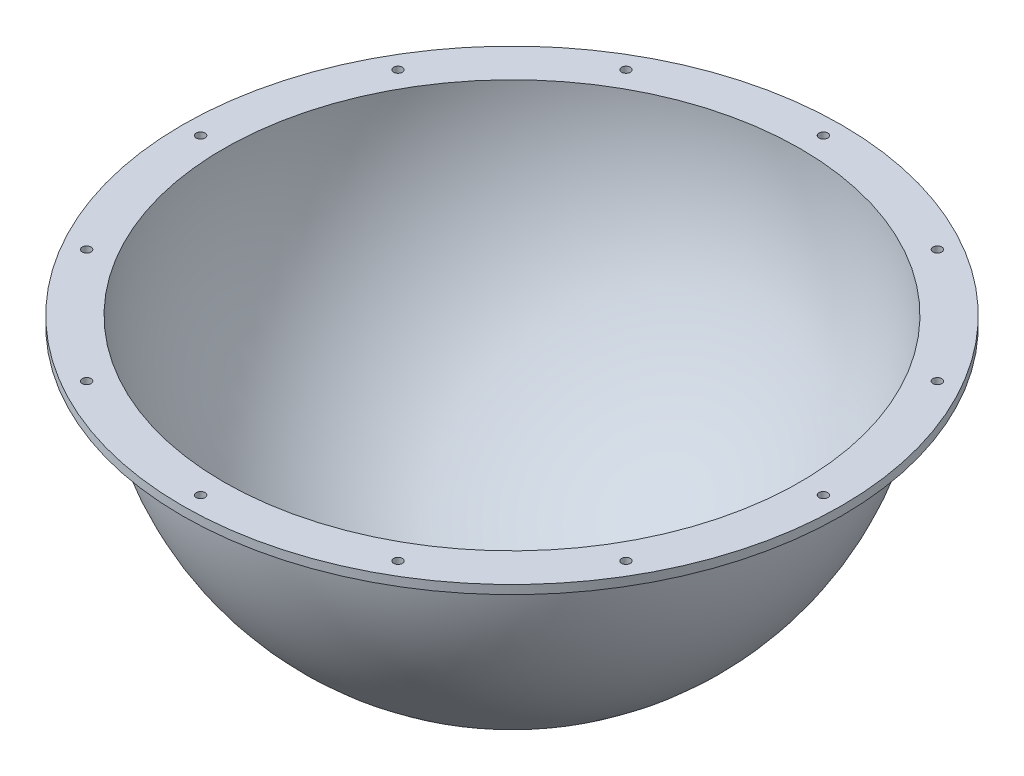
ISO-10303-21;
HEADER;
FILE_DESCRIPTION(('STEP AP214'),'2;1');
FILE_NAME('part.step','',(''),(''),'','','');
FILE_SCHEMA(('AUTOMOTIVE_DESIGN { 1 0 10303 214 1 1 1 1 }'));
ENDSEC;
DATA;
#1=APPLICATION_CONTEXT('core data for automotive mechanical design processes');
#2=APPLICATION_PROTOCOL_DEFINITION('international standard','automotive_design',2000,#1);
#3=PRODUCT_CONTEXT('',#1,'mechanical');
#4=PRODUCT('Part','Part','',(#3));
#5=PRODUCT_RELATED_PRODUCT_CATEGORY('part','',(#4));
#6=PRODUCT_DEFINITION_FORMATION('','',#4);
#7=PRODUCT_DEFINITION_CONTEXT('part definition',#1,'design');
#8=PRODUCT_DEFINITION('design','',#6,#7);
#9=PRODUCT_DEFINITION_SHAPE('','',#8);
#10=(LENGTH_UNIT() NAMED_UNIT(*) SI_UNIT(.MILLI.,.METRE.));
#11=(NAMED_UNIT(*) PLANE_ANGLE_UNIT() SI_UNIT($,.RADIAN.));
#12=(NAMED_UNIT(*) SI_UNIT($,.STERADIAN.) SOLID_ANGLE_UNIT());
#13=UNCERTAINTY_MEASURE_WITH_UNIT(LENGTH_MEASURE(1.E-05),#10,'distance_accuracy_value','');
#14=(GEOMETRIC_REPRESENTATION_CONTEXT(3) GLOBAL_UNCERTAINTY_ASSIGNED_CONTEXT((#13)) GLOBAL_UNIT_ASSIGNED_CONTEXT((#10,
#11,#12)) REPRESENTATION_CONTEXT('',''));
#15=CARTESIAN_POINT('',(0.,0.,0.));
#16=DIRECTION('',(0.,0.,1.));
#17=DIRECTION('',(1.,0.,0.));
#18=AXIS2_PLACEMENT_3D('',#15,#16,#17);
#19=CARTESIAN_POINT('',(0.,0.,0.));
#20=DIRECTION('',(0.,0.,-1.));
#21=DIRECTION('',(-1.,0.,0.));
#22=AXIS2_PLACEMENT_3D('',#19,#20,#21);
#23=SPHERICAL_SURFACE('',#22,393.75);
#24=CARTESIAN_POINT('',(0.,0.,0.));
#25=DIRECTION('',(0.,1.,0.));
#26=DIRECTION('',(0.,0.,1.));
#27=AXIS2_PLACEMENT_3D('',#24,#25,#26);
#28=SPHERICAL_SURFACE('',#27,393.75);
#29=CARTESIAN_POINT('',(0.,0.,0.));
#30=DIRECTION('',(0.,1.,0.));
#31=DIRECTION('',(0.,0.,1.));
#32=AXIS2_PLACEMENT_3D('',#29,#30,#31);
#33=CIRCLE('',#32,393.75);
#34=CARTESIAN_POINT('',(0.,0.,393.75));
#35=VERTEX_POINT('',#34);
#36=EDGE_CURVE('E10',#35,#35,#33,.T.);
#37=ORIENTED_EDGE('',*,*,#36,.T.);
#38=EDGE_LOOP('',(#37));
#39=FACE_BOUND('',#38,.T.);
#40=ADVANCED_FACE('F31',(#39),#28,.F.);
#41=CARTESIAN_POINT('',(0.,0.,0.));
#42=DIRECTION('',(0.,-1.,0.));
#43=DIRECTION('',(0.,0.,1.));
#44=AXIS2_PLACEMENT_3D('',#41,#42,#43);
#45=PLANE('',#44);
#46=CARTESIAN_POINT('',(0.,0.,-425.));
#47=DIRECTION('',(0.,1.,0.));
#48=DIRECTION('',(-1.,0.,0.));
#49=AXIS2_PLACEMENT_3D('',#46,#47,#48);
#50=CIRCLE('',#49,6.);
#51=CARTESIAN_POINT('',(-6.,0.,-425.));
#52=VERTEX_POINT('',#51);
#53=EDGE_CURVE('E52',#52,#52,#50,.T.);
#54=ORIENTED_EDGE('',*,*,#53,.F.);
#55=EDGE_LOOP('',(#54));
#56=FACE_BOUND('',#55,.T.);
#57=CARTESIAN_POINT('',(212.500000000001,1.48387956900834E-12,-368.060796608386));
#58=DIRECTION('',(0.,1.,0.));
#59=DIRECTION('',(-1.,0.,0.));
#60=AXIS2_PLACEMENT_3D('',#57,#58,#59);
#61=CIRCLE('',#60,6.00000000000002);
#62=CARTESIAN_POINT('',(206.500000000001,1.44198179294222E-12,-368.060796608386));
#63=VERTEX_POINT('',#62);
#64=EDGE_CURVE('E117',#63,#63,#61,.T.);
#65=ORIENTED_EDGE('',*,*,#64,.F.);
#66=EDGE_LOOP('',(#65));
#67=FACE_BOUND('',#66,.T.);
#68=CARTESIAN_POINT('',(368.060796608387,2.57015480583584E-12,-212.5));
#69=DIRECTION('',(0.,1.,0.));
#70=DIRECTION('',(-1.,0.,0.));
#71=AXIS2_PLACEMENT_3D('',#68,#69,#70);
#72=CIRCLE('',#71,5.99999999999999);
#73=CARTESIAN_POINT('',(362.060796608387,2.52825702976973E-12,-212.5));
#74=VERTEX_POINT('',#73);
#75=EDGE_CURVE('E120',#74,#74,#72,.T.);
#76=ORIENTED_EDGE('',*,*,#75,.F.);
#77=EDGE_LOOP('',(#76));
#78=FACE_BOUND('',#77,.T.);
#79=CARTESIAN_POINT('',(425.000000000001,2.96775913801667E-12,5.6230663368303E-13));
#80=DIRECTION('',(0.,1.,0.));
#81=DIRECTION('',(-1.,0.,0.));
#82=AXIS2_PLACEMENT_3D('',#79,#80,#81);
#83=CIRCLE('',#82,5.99999999999999);
#84=CARTESIAN_POINT('',(419.000000000001,2.92586136195055E-12,5.6230663368303E-13));
#85=VERTEX_POINT('',#84);
#86=EDGE_CURVE('E109',#85,#85,#83,.T.);
#87=ORIENTED_EDGE('',*,*,#86,.F.);
#88=EDGE_LOOP('',(#87));
#89=FACE_BOUND('',#88,.T.);
#90=CARTESIAN_POINT('',(-212.5,-1.48387956900833E-12,-368.060796608386));
#91=DIRECTION('',(0.,1.,0.));
#92=DIRECTION('',(-1.,0.,0.));
#93=AXIS2_PLACEMENT_3D('',#90,#91,#92);
#94=CIRCLE('',#93,5.99999999999999);
#95=CARTESIAN_POINT('',(-218.5,-1.52577734507445E-12,-368.060796608386));
#96=VERTEX_POINT('',#95);
#97=EDGE_CURVE('E102',#96,#96,#94,.T.);
#98=ORIENTED_EDGE('',*,*,#97,.F.);
#99=EDGE_LOOP('',(#98));
#100=FACE_BOUND('',#99,.T.);
#101=CARTESIAN_POINT('',(-368.060796608387,-2.57015480583584E-12,-212.499999999999));
#102=DIRECTION('',(0.,1.,0.));
#103=DIRECTION('',(-1.,0.,0.));
#104=AXIS2_PLACEMENT_3D('',#101,#102,#103);
#105=CIRCLE('',#104,5.99999999999999);
#106=CARTESIAN_POINT('',(-374.060796608387,-2.61205258190196E-12,-212.499999999999));
#107=VERTEX_POINT('',#106);
#108=EDGE_CURVE('E99',#107,#107,#105,.T.);
#109=ORIENTED_EDGE('',*,*,#108,.F.);
#110=EDGE_LOOP('',(#109));
#111=FACE_BOUND('',#110,.T.);
#112=CARTESIAN_POINT('',(-425.000000000001,-2.96775913801667E-12,9.30143396522419E-13));
#113=DIRECTION('',(0.,1.,0.));
#114=DIRECTION('',(-1.,0.,0.));
#115=AXIS2_PLACEMENT_3D('',#112,#113,#114);
#116=CIRCLE('',#115,5.99999999999999);
#117=CARTESIAN_POINT('',(-431.000000000001,-3.00965691408278E-12,9.30143396522419E-13));
#118=VERTEX_POINT('',#117);
#119=EDGE_CURVE('E95',#118,#118,#116,.T.);
#120=ORIENTED_EDGE('',*,*,#119,.F.);
#121=EDGE_LOOP('',(#120));
#122=FACE_BOUND('',#121,.T.);
#123=CARTESIAN_POINT('',(-368.060796608387,-2.57015480583584E-12,212.500000000001));
#124=DIRECTION('',(0.,1.,0.));
#125=DIRECTION('',(-1.,0.,0.));
#126=AXIS2_PLACEMENT_3D('',#123,#124,#125);
#127=CIRCLE('',#126,5.99999999999999);
#128=CARTESIAN_POINT('',(-374.060796608387,-2.61205258190196E-12,212.500000000001));
#129=VERTEX_POINT('',#128);
#130=EDGE_CURVE('E92',#129,#129,#127,.T.);
#131=ORIENTED_EDGE('',*,*,#130,.F.);
#132=EDGE_LOOP('',(#131));
#133=FACE_BOUND('',#132,.T.);
#134=CARTESIAN_POINT('',(-212.5,-1.48387956900833E-12,368.060796608388));
#135=DIRECTION('',(0.,1.,0.));
#136=DIRECTION('',(-1.,0.,0.));
#137=AXIS2_PLACEMENT_3D('',#134,#135,#136);
#138=CIRCLE('',#137,6.00000000000007);
#139=CARTESIAN_POINT('',(-218.5,-1.52577734507445E-12,368.060796608388));
#140=VERTEX_POINT('',#139);
#141=EDGE_CURVE('E96',#140,#140,#138,.T.);
#142=ORIENTED_EDGE('',*,*,#141,.F.);
#143=EDGE_LOOP('',(#142));
#144=FACE_BOUND('',#143,.T.);
#145=CARTESIAN_POINT('',(4.19884290470205E-13,0.,425.000000000001));
#146=DIRECTION('',(0.,1.,0.));
#147=DIRECTION('',(-1.,0.,0.));
#148=AXIS2_PLACEMENT_3D('',#145,#146,#147);
#149=CIRCLE('',#148,6.);
#150=CARTESIAN_POINT('',(-5.99999999999958,0.,425.000000000001));
#151=VERTEX_POINT('',#150);
#152=EDGE_CURVE('E112',#151,#151,#149,.T.);
#153=ORIENTED_EDGE('',*,*,#152,.F.);
#154=EDGE_LOOP('',(#153));
#155=FACE_BOUND('',#154,.T.);
#156=CARTESIAN_POINT('',(212.500000000001,1.48387956900834E-12,368.060796608388));
#157=DIRECTION('',(0.,1.,0.));
#158=DIRECTION('',(-1.,0.,0.));
#159=AXIS2_PLACEMENT_3D('',#156,#157,#158);
#160=CIRCLE('',#159,5.99999999999999);
#161=CARTESIAN_POINT('',(206.500000000001,1.44198179294222E-12,368.060796608388));
#162=VERTEX_POINT('',#161);
#163=EDGE_CURVE('E108',#162,#162,#160,.T.);
#164=ORIENTED_EDGE('',*,*,#163,.F.);
#165=EDGE_LOOP('',(#164));
#166=FACE_BOUND('',#165,.T.);
#167=CARTESIAN_POINT('',(368.060796608387,2.57015480583585E-12,212.500000000001));
#168=DIRECTION('',(0.,1.,0.));
#169=DIRECTION('',(-1.,0.,0.));
#170=AXIS2_PLACEMENT_3D('',#167,#168,#169);
#171=CIRCLE('',#170,5.99999999999999);
#172=CARTESIAN_POINT('',(362.060796608387,2.52825702976973E-12,212.500000000001));
#173=VERTEX_POINT('',#172);
#174=EDGE_CURVE('E105',#173,#173,#171,.T.);
#175=ORIENTED_EDGE('',*,*,#174,.F.);
#176=EDGE_LOOP('',(#175));
#177=FACE_BOUND('',#176,.T.);
#178=ORIENTED_EDGE('',*,*,#36,.F.);
#179=EDGE_LOOP('',(#178));
#180=FACE_BOUND('',#179,.T.);
#181=CARTESIAN_POINT('',(0.,0.,0.));
#182=DIRECTION('',(0.,-1.,0.));
#183=DIRECTION('',(0.,0.,-1.));
#184=AXIS2_PLACEMENT_3D('',#181,#182,#183);
#185=CIRCLE('',#184,450.);
#186=CARTESIAN_POINT('',(0.,0.,-450.));
#187=VERTEX_POINT('',#186);
#188=EDGE_CURVE('E39',#187,#187,#185,.T.);
#189=ORIENTED_EDGE('',*,*,#188,.F.);
#190=EDGE_LOOP('',(#189));
#191=FACE_BOUND('',#190,.T.);
#192=ADVANCED_FACE('F131',(#56,#67,#78,#89,#100,#111,#122,#133,#144,#155,#166,#177,#180,#191),
#45,.F.);
#193=CARTESIAN_POINT('',(0.,0.,0.));
#194=DIRECTION('',(0.,-1.,0.));
#195=DIRECTION('',(0.,0.,-1.));
#196=AXIS2_PLACEMENT_3D('',#193,#194,#195);
#197=CYLINDRICAL_SURFACE('',#196,450.);
#198=CARTESIAN_POINT('',(0.,-12.,0.));
#199=DIRECTION('',(0.,-1.,0.));
#200=DIRECTION('',(0.,0.,-1.));
#201=AXIS2_PLACEMENT_3D('',#198,#199,#200);
#202=CIRCLE('',#201,450.);
#203=CARTESIAN_POINT('',(0.,-12.,-450.));
#204=VERTEX_POINT('',#203);
#205=EDGE_CURVE('E44',#204,#204,#202,.T.);
#206=ORIENTED_EDGE('',*,*,#205,.F.);
#207=EDGE_LOOP('',(#206));
#208=FACE_BOUND('',#207,.T.);
#209=ORIENTED_EDGE('',*,*,#188,.T.);
#210=EDGE_LOOP('',(#209));
#211=FACE_BOUND('',#210,.T.);
#212=ADVANCED_FACE('F134',(#208,#211),#197,.T.);
#213=CARTESIAN_POINT('',(0.,-12.,450.));
#214=DIRECTION('',(0.,1.,0.));
#215=DIRECTION('',(0.,0.,1.));
#216=AXIS2_PLACEMENT_3D('',#213,#214,#215);
#217=PLANE('',#216);
#218=CARTESIAN_POINT('',(0.,-12.,-425.));
#219=DIRECTION('',(0.,1.,0.));
#220=DIRECTION('',(0.,0.,1.));
#221=AXIS2_PLACEMENT_3D('',#218,#219,#220);
#222=CIRCLE('',#221,6.);
#223=CARTESIAN_POINT('',(0.,-12.,-419.));
#224=VERTEX_POINT('',#223);
#225=EDGE_CURVE('E35',#224,#224,#222,.T.);
#226=ORIENTED_EDGE('',*,*,#225,.T.);
#227=EDGE_LOOP('',(#226));
#228=FACE_BOUND('',#227,.T.);
#229=CARTESIAN_POINT('',(212.500000000001,-12.,-368.060796608386));
#230=DIRECTION('',(0.,1.,0.));
#231=DIRECTION('',(0.,0.,1.));
#232=AXIS2_PLACEMENT_3D('',#229,#230,#231);
#233=CIRCLE('',#232,6.00000000000002);
#234=CARTESIAN_POINT('',(212.500000000001,-12.,-362.060796608386));
#235=VERTEX_POINT('',#234);
#236=EDGE_CURVE('E78',#235,#235,#233,.T.);
#237=ORIENTED_EDGE('',*,*,#236,.T.);
#238=EDGE_LOOP('',(#237));
#239=FACE_BOUND('',#238,.T.);
#240=CARTESIAN_POINT('',(368.060796608387,-12.,-212.5));
#241=DIRECTION('',(0.,1.,0.));
#242=DIRECTION('',(0.,0.,1.));
#243=AXIS2_PLACEMENT_3D('',#240,#241,#242);
#244=CIRCLE('',#243,5.99999999999999);
#245=CARTESIAN_POINT('',(368.060796608387,-12.,-206.5));
#246=VERTEX_POINT('',#245);
#247=EDGE_CURVE('E76',#246,#246,#244,.T.);
#248=ORIENTED_EDGE('',*,*,#247,.T.);
#249=EDGE_LOOP('',(#248));
#250=FACE_BOUND('',#249,.T.);
#251=CARTESIAN_POINT('',(425.000000000001,-12.,5.6230663368303E-13));
#252=DIRECTION('',(0.,1.,0.));
#253=DIRECTION('',(0.,0.,1.));
#254=AXIS2_PLACEMENT_3D('',#251,#252,#253);
#255=CIRCLE('',#254,5.99999999999999);
#256=CARTESIAN_POINT('',(425.000000000001,-12.,6.00000000000055));
#257=VERTEX_POINT('',#256);
#258=EDGE_CURVE('E73',#257,#257,#255,.T.);
#259=ORIENTED_EDGE('',*,*,#258,.T.);
#260=EDGE_LOOP('',(#259));
#261=FACE_BOUND('',#260,.T.);
#262=CARTESIAN_POINT('',(-212.5,-12.,-368.060796608386));
#263=DIRECTION('',(0.,1.,0.));
#264=DIRECTION('',(0.,0.,1.));
#265=AXIS2_PLACEMENT_3D('',#262,#263,#264);
#266=CIRCLE('',#265,5.99999999999999);
#267=CARTESIAN_POINT('',(-212.5,-12.,-362.060796608386));
#268=VERTEX_POINT('',#267);
#269=EDGE_CURVE('E70',#268,#268,#266,.T.);
#270=ORIENTED_EDGE('',*,*,#269,.T.);
#271=EDGE_LOOP('',(#270));
#272=FACE_BOUND('',#271,.T.);
#273=CARTESIAN_POINT('',(-368.060796608387,-12.,-212.499999999999));
#274=DIRECTION('',(0.,1.,0.));
#275=DIRECTION('',(0.,0.,1.));
#276=AXIS2_PLACEMENT_3D('',#273,#274,#275);
#277=CIRCLE('',#276,5.99999999999999);
#278=CARTESIAN_POINT('',(-368.060796608387,-12.,-206.5));
#279=VERTEX_POINT('',#278);
#280=EDGE_CURVE('E67',#279,#279,#277,.T.);
#281=ORIENTED_EDGE('',*,*,#280,.T.);
#282=EDGE_LOOP('',(#281));
#283=FACE_BOUND('',#282,.T.);
#284=CARTESIAN_POINT('',(-425.,-12.,9.30143396522419E-13));
#285=DIRECTION('',(0.,1.,0.));
#286=DIRECTION('',(0.,0.,1.));
#287=AXIS2_PLACEMENT_3D('',#284,#285,#286);
#288=CIRCLE('',#287,5.99999999999999);
#289=CARTESIAN_POINT('',(-425.,-12.,6.00000000000092));
#290=VERTEX_POINT('',#289);
#291=EDGE_CURVE('E64',#290,#290,#288,.T.);
#292=ORIENTED_EDGE('',*,*,#291,.T.);
#293=EDGE_LOOP('',(#292));
#294=FACE_BOUND('',#293,.T.);
#295=CARTESIAN_POINT('',(-368.060796608387,-12.,212.500000000001));
#296=DIRECTION('',(0.,1.,0.));
#297=DIRECTION('',(0.,0.,1.));
#298=AXIS2_PLACEMENT_3D('',#295,#296,#297);
#299=CIRCLE('',#298,5.99999999999999);
#300=CARTESIAN_POINT('',(-368.060796608387,-12.,218.500000000001));
#301=VERTEX_POINT('',#300);
#302=EDGE_CURVE('E61',#301,#301,#299,.T.);
#303=ORIENTED_EDGE('',*,*,#302,.T.);
#304=EDGE_LOOP('',(#303));
#305=FACE_BOUND('',#304,.T.);
#306=CARTESIAN_POINT('',(-212.5,-12.,368.060796608388));
#307=DIRECTION('',(0.,1.,0.));
#308=DIRECTION('',(0.,0.,1.));
#309=AXIS2_PLACEMENT_3D('',#306,#307,#308);
#310=CIRCLE('',#309,6.00000000000007);
#311=CARTESIAN_POINT('',(-212.5,-12.,374.060796608388));
#312=VERTEX_POINT('',#311);
#313=EDGE_CURVE('E58',#312,#312,#310,.T.);
#314=ORIENTED_EDGE('',*,*,#313,.T.);
#315=EDGE_LOOP('',(#314));
#316=FACE_BOUND('',#315,.T.);
#317=CARTESIAN_POINT('',(5.0367984260244E-13,-12.,425.000000000001));
#318=DIRECTION('',(0.,1.,0.));
#319=DIRECTION('',(0.,0.,1.));
#320=AXIS2_PLACEMENT_3D('',#317,#318,#319);
#321=CIRCLE('',#320,6.);
#322=CARTESIAN_POINT('',(5.0367984260244E-13,-12.,431.000000000001));
#323=VERTEX_POINT('',#322);
#324=EDGE_CURVE('E55',#323,#323,#321,.T.);
#325=ORIENTED_EDGE('',*,*,#324,.T.);
#326=EDGE_LOOP('',(#325));
#327=FACE_BOUND('',#326,.T.);
#328=CARTESIAN_POINT('',(212.500000000001,-12.,368.060796608388));
#329=DIRECTION('',(0.,1.,0.));
#330=DIRECTION('',(0.,0.,1.));
#331=AXIS2_PLACEMENT_3D('',#328,#329,#330);
#332=CIRCLE('',#331,5.99999999999999);
#333=CARTESIAN_POINT('',(212.500000000001,-12.,374.060796608388));
#334=VERTEX_POINT('',#333);
#335=EDGE_CURVE('E51',#334,#334,#332,.T.);
#336=ORIENTED_EDGE('',*,*,#335,.T.);
#337=EDGE_LOOP('',(#336));
#338=FACE_BOUND('',#337,.T.);
#339=CARTESIAN_POINT('',(368.060796608387,-12.,212.500000000001));
#340=DIRECTION('',(0.,1.,0.));
#341=DIRECTION('',(0.,0.,1.));
#342=AXIS2_PLACEMENT_3D('',#339,#340,#341);
#343=CIRCLE('',#342,5.99999999999999);
#344=CARTESIAN_POINT('',(368.060796608387,-12.,218.500000000001));
#345=VERTEX_POINT('',#344);
#346=EDGE_CURVE('E48',#345,#345,#343,.T.);
#347=ORIENTED_EDGE('',*,*,#346,.T.);
#348=EDGE_LOOP('',(#347));
#349=FACE_BOUND('',#348,.T.);
#350=CARTESIAN_POINT('',(0.,-12.,0.));
#351=DIRECTION('',(0.,-1.,0.));
#352=DIRECTION('',(0.,0.,-1.));
#353=AXIS2_PLACEMENT_3D('',#350,#351,#352);
#354=CIRCLE('',#353,399.819959481765);
#355=CARTESIAN_POINT('',(0.,-12.,-399.819959481765));
#356=VERTEX_POINT('',#355);
#357=EDGE_CURVE('E83',#356,#356,#354,.T.);
#358=ORIENTED_EDGE('',*,*,#357,.F.);
#359=EDGE_LOOP('',(#358));
#360=FACE_BOUND('',#359,.T.);
#361=ORIENTED_EDGE('',*,*,#205,.T.);
#362=EDGE_LOOP('',(#361));
#363=FACE_BOUND('',#362,.T.);
#364=ADVANCED_FACE('F162',(#228,#239,#250,#261,#272,#283,#294,#305,#316,#327,#338,#349,#360,
#363),#217,.F.);
#365=CARTESIAN_POINT('',(0.,0.,0.));
#366=DIRECTION('',(0.,0.,-1.));
#367=DIRECTION('',(-1.,0.,0.));
#368=AXIS2_PLACEMENT_3D('',#365,#366,#367);
#369=SPHERICAL_SURFACE('',#368,400.);
#370=CARTESIAN_POINT('',(0.,0.,0.));
#371=DIRECTION('',(0.,-1.,0.));
#372=DIRECTION('',(0.,0.,-1.));
#373=AXIS2_PLACEMENT_3D('',#370,#371,#372);
#374=SPHERICAL_SURFACE('',#373,400.);
#375=ORIENTED_EDGE('',*,*,#357,.T.);
#376=EDGE_LOOP('',(#375));
#377=FACE_BOUND('',#376,.T.);
#378=ADVANCED_FACE('F33',(#377),#374,.T.);
#379=CARTESIAN_POINT('',(368.06079660839,-400.000000000001,212.500000000001));
#380=DIRECTION('',(0.,1.,0.));
#381=DIRECTION('',(-1.,0.,0.));
#382=AXIS2_PLACEMENT_3D('',#379,#380,#381);
#383=CYLINDRICAL_SURFACE('',#382,5.99999999999999);
#384=ORIENTED_EDGE('',*,*,#174,.T.);
#385=EDGE_LOOP('',(#384));
#386=FACE_BOUND('',#385,.T.);
#387=ORIENTED_EDGE('',*,*,#346,.F.);
#388=EDGE_LOOP('',(#387));
#389=FACE_BOUND('',#388,.T.);
#390=ADVANCED_FACE('F195',(#386,#389),#383,.F.);
#391=CARTESIAN_POINT('',(212.500000000003,-400.000000000002,368.060796608388));
#392=DIRECTION('',(0.,1.,0.));
#393=DIRECTION('',(-1.,0.,0.));
#394=AXIS2_PLACEMENT_3D('',#391,#392,#393);
#395=CYLINDRICAL_SURFACE('',#394,5.99999999999999);
#396=ORIENTED_EDGE('',*,*,#163,.T.);
#397=EDGE_LOOP('',(#396));
#398=FACE_BOUND('',#397,.T.);
#399=ORIENTED_EDGE('',*,*,#335,.F.);
#400=EDGE_LOOP('',(#399));
#401=FACE_BOUND('',#400,.T.);
#402=ADVANCED_FACE('F199',(#398,#401),#395,.F.);
#403=CARTESIAN_POINT('',(3.21306936154473E-12,-400.000000000003,425.000000000001));
#404=DIRECTION('',(0.,1.,0.));
#405=DIRECTION('',(-1.,0.,0.));
#406=AXIS2_PLACEMENT_3D('',#403,#404,#405);
#407=CYLINDRICAL_SURFACE('',#406,6.);
#408=ORIENTED_EDGE('',*,*,#152,.T.);
#409=EDGE_LOOP('',(#408));
#410=FACE_BOUND('',#409,.T.);
#411=ORIENTED_EDGE('',*,*,#324,.F.);
#412=EDGE_LOOP('',(#411));
#413=FACE_BOUND('',#412,.T.);
#414=ADVANCED_FACE('F209',(#410,#413),#407,.F.);
#415=CARTESIAN_POINT('',(-212.499999999997,-400.000000000005,368.060796608388));
#416=DIRECTION('',(0.,1.,0.));
#417=DIRECTION('',(-1.,0.,0.));
#418=AXIS2_PLACEMENT_3D('',#415,#416,#417);
#419=CYLINDRICAL_SURFACE('',#418,6.00000000000007);
#420=ORIENTED_EDGE('',*,*,#141,.T.);
#421=EDGE_LOOP('',(#420));
#422=FACE_BOUND('',#421,.T.);
#423=ORIENTED_EDGE('',*,*,#313,.F.);
#424=EDGE_LOOP('',(#423));
#425=FACE_BOUND('',#424,.T.);
#426=ADVANCED_FACE('F219',(#422,#425),#419,.F.);
#427=CARTESIAN_POINT('',(-368.060796608384,-400.000000000006,212.500000000001));
#428=DIRECTION('',(0.,1.,0.));
#429=DIRECTION('',(-1.,0.,0.));
#430=AXIS2_PLACEMENT_3D('',#427,#428,#429);
#431=CYLINDRICAL_SURFACE('',#430,5.99999999999999);
#432=ORIENTED_EDGE('',*,*,#130,.T.);
#433=EDGE_LOOP('',(#432));
#434=FACE_BOUND('',#433,.T.);
#435=ORIENTED_EDGE('',*,*,#302,.F.);
#436=EDGE_LOOP('',(#435));
#437=FACE_BOUND('',#436,.T.);
#438=ADVANCED_FACE('F229',(#434,#437),#431,.F.);
#439=CARTESIAN_POINT('',(-424.999999999998,-400.000000000006,9.30143396522419E-13));
#440=DIRECTION('',(0.,1.,0.));
#441=DIRECTION('',(-1.,0.,0.));
#442=AXIS2_PLACEMENT_3D('',#439,#440,#441);
#443=CYLINDRICAL_SURFACE('',#442,5.99999999999999);
#444=ORIENTED_EDGE('',*,*,#119,.T.);
#445=EDGE_LOOP('',(#444));
#446=FACE_BOUND('',#445,.T.);
#447=ORIENTED_EDGE('',*,*,#291,.F.);
#448=EDGE_LOOP('',(#447));
#449=FACE_BOUND('',#448,.T.);
#450=ADVANCED_FACE('F239',(#446,#449),#443,.F.);
#451=CARTESIAN_POINT('',(-368.060796608384,-400.000000000006,-212.499999999999));
#452=DIRECTION('',(0.,1.,0.));
#453=DIRECTION('',(-1.,0.,0.));
#454=AXIS2_PLACEMENT_3D('',#451,#452,#453);
#455=CYLINDRICAL_SURFACE('',#454,5.99999999999999);
#456=ORIENTED_EDGE('',*,*,#108,.T.);
#457=EDGE_LOOP('',(#456));
#458=FACE_BOUND('',#457,.T.);
#459=ORIENTED_EDGE('',*,*,#280,.F.);
#460=EDGE_LOOP('',(#459));
#461=FACE_BOUND('',#460,.T.);
#462=ADVANCED_FACE('F249',(#458,#461),#455,.F.);
#463=CARTESIAN_POINT('',(-212.499999999997,-400.000000000005,-368.060796608386));
#464=DIRECTION('',(0.,1.,0.));
#465=DIRECTION('',(-1.,0.,0.));
#466=AXIS2_PLACEMENT_3D('',#463,#464,#465);
#467=CYLINDRICAL_SURFACE('',#466,5.99999999999999);
#468=ORIENTED_EDGE('',*,*,#97,.T.);
#469=EDGE_LOOP('',(#468));
#470=FACE_BOUND('',#469,.T.);
#471=ORIENTED_EDGE('',*,*,#269,.F.);
#472=EDGE_LOOP('',(#471));
#473=FACE_BOUND('',#472,.T.);
#474=ADVANCED_FACE('F259',(#470,#473),#467,.F.);
#475=CARTESIAN_POINT('',(425.000000000004,-400.,5.6230663368303E-13));
#476=DIRECTION('',(0.,1.,0.));
#477=DIRECTION('',(-1.,0.,0.));
#478=AXIS2_PLACEMENT_3D('',#475,#476,#477);
#479=CYLINDRICAL_SURFACE('',#478,5.99999999999999);
#480=ORIENTED_EDGE('',*,*,#86,.T.);
#481=EDGE_LOOP('',(#480));
#482=FACE_BOUND('',#481,.T.);
#483=ORIENTED_EDGE('',*,*,#258,.F.);
#484=EDGE_LOOP('',(#483));
#485=FACE_BOUND('',#484,.T.);
#486=ADVANCED_FACE('F269',(#482,#485),#479,.F.);
#487=CARTESIAN_POINT('',(368.06079660839,-400.000000000001,-212.5));
#488=DIRECTION('',(0.,1.,0.));
#489=DIRECTION('',(-1.,0.,0.));
#490=AXIS2_PLACEMENT_3D('',#487,#488,#489);
#491=CYLINDRICAL_SURFACE('',#490,5.99999999999999);
#492=ORIENTED_EDGE('',*,*,#75,.T.);
#493=EDGE_LOOP('',(#492));
#494=FACE_BOUND('',#493,.T.);
#495=ORIENTED_EDGE('',*,*,#247,.F.);
#496=EDGE_LOOP('',(#495));
#497=FACE_BOUND('',#496,.T.);
#498=ADVANCED_FACE('F279',(#494,#497),#491,.F.);
#499=CARTESIAN_POINT('',(212.500000000004,-400.000000000002,-368.060796608386));
#500=DIRECTION('',(0.,1.,0.));
#501=DIRECTION('',(-1.,0.,0.));
#502=AXIS2_PLACEMENT_3D('',#499,#500,#501);
#503=CYLINDRICAL_SURFACE('',#502,6.00000000000002);
#504=ORIENTED_EDGE('',*,*,#64,.T.);
#505=EDGE_LOOP('',(#504));
#506=FACE_BOUND('',#505,.T.);
#507=ORIENTED_EDGE('',*,*,#236,.F.);
#508=EDGE_LOOP('',(#507));
#509=FACE_BOUND('',#508,.T.);
#510=ADVANCED_FACE('F289',(#506,#509),#503,.F.);
#511=CARTESIAN_POINT('',(2.79318507107453E-12,-400.000000000003,-425.));
#512=DIRECTION('',(0.,1.,0.));
#513=DIRECTION('',(-1.,0.,0.));
#514=AXIS2_PLACEMENT_3D('',#511,#512,#513);
#515=CYLINDRICAL_SURFACE('',#514,6.);
#516=ORIENTED_EDGE('',*,*,#53,.T.);
#517=EDGE_LOOP('',(#516));
#518=FACE_BOUND('',#517,.T.);
#519=ORIENTED_EDGE('',*,*,#225,.F.);
#520=EDGE_LOOP('',(#519));
#521=FACE_BOUND('',#520,.T.);
#522=ADVANCED_FACE('F128',(#518,#521),#515,.F.);
#523=CLOSED_SHELL('',(#40,#192,#212,#364,#378,#390,#402,#414,#426,#438,#450,#462,#474,#486,#498,
#510,#522));
#524=MANIFOLD_SOLID_BREP('B2',#523);
#525=ADVANCED_BREP_SHAPE_REPRESENTATION('',(#18,#524),#14);
#526=SHAPE_DEFINITION_REPRESENTATION(#9,#525);
ENDSEC;
END-ISO-10303-21;
